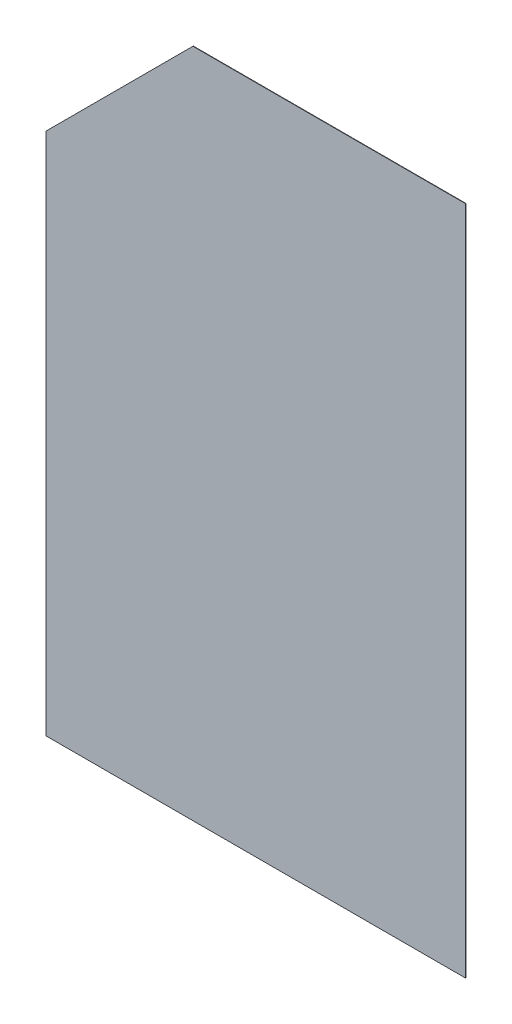
ISO-10303-21;
HEADER;
FILE_DESCRIPTION(('STEP AP214'),'2;1');
FILE_NAME('part.step','',(''),(''),'','','');
FILE_SCHEMA(('AUTOMOTIVE_DESIGN { 1 0 10303 214 1 1 1 1 }'));
ENDSEC;
DATA;
#1=APPLICATION_CONTEXT('core data for automotive mechanical design processes');
#2=APPLICATION_PROTOCOL_DEFINITION('international standard','automotive_design',2000,#1);
#3=PRODUCT_CONTEXT('',#1,'mechanical');
#4=PRODUCT('Part','Part','',(#3));
#5=PRODUCT_RELATED_PRODUCT_CATEGORY('part','',(#4));
#6=PRODUCT_DEFINITION_FORMATION('','',#4);
#7=PRODUCT_DEFINITION_CONTEXT('part definition',#1,'design');
#8=PRODUCT_DEFINITION('design','',#6,#7);
#9=PRODUCT_DEFINITION_SHAPE('','',#8);
#10=(LENGTH_UNIT() NAMED_UNIT(*) SI_UNIT(.MILLI.,.METRE.));
#11=(NAMED_UNIT(*) PLANE_ANGLE_UNIT() SI_UNIT($,.RADIAN.));
#12=(NAMED_UNIT(*) SI_UNIT($,.STERADIAN.) SOLID_ANGLE_UNIT());
#13=UNCERTAINTY_MEASURE_WITH_UNIT(LENGTH_MEASURE(1.E-05),#10,'distance_accuracy_value','');
#14=(GEOMETRIC_REPRESENTATION_CONTEXT(3) GLOBAL_UNCERTAINTY_ASSIGNED_CONTEXT((#13)) GLOBAL_UNIT_ASSIGNED_CONTEXT((#10,
#11,#12)) REPRESENTATION_CONTEXT('',''));
#15=CARTESIAN_POINT('',(0.,0.,0.));
#16=DIRECTION('',(0.,0.,1.));
#17=DIRECTION('',(1.,0.,0.));
#18=AXIS2_PLACEMENT_3D('',#15,#16,#17);
#19=CARTESIAN_POINT('',(0.,0.,0.001));
#20=DIRECTION('',(0.,0.,-1.));
#21=DIRECTION('',(-1.,0.,0.));
#22=AXIS2_PLACEMENT_3D('',#19,#20,#21);
#23=PLANE('',#22);
#24=DIRECTION('',(0.,1.,0.));
#25=VECTOR('',#24,1.);
#26=CARTESIAN_POINT('',(1.,0.,0.001));
#27=LINE('',#26,#25);
#28=CARTESIAN_POINT('',(1.,0.,0.001));
#29=VERTEX_POINT('',#28);
#30=CARTESIAN_POINT('',(1.,1.6,0.001));
#31=VERTEX_POINT('',#30);
#32=EDGE_CURVE('E85',#29,#31,#27,.T.);
#33=ORIENTED_EDGE('',*,*,#32,.T.);
#34=DIRECTION('',(1.,0.,0.));
#35=VECTOR('',#34,1.);
#36=CARTESIAN_POINT('',(1.,1.6,0.001));
#37=LINE('',#36,#35);
#38=CARTESIAN_POINT('',(0.35,1.6,0.001));
#39=VERTEX_POINT('',#38);
#40=EDGE_CURVE('E66',#31,#39,#37,.F.);
#41=ORIENTED_EDGE('',*,*,#40,.T.);
#42=DIRECTION('',(0.707106781186548,0.707106781186548,0.));
#43=VECTOR('',#42,1.);
#44=CARTESIAN_POINT('',(0.35,1.6,0.001));
#45=LINE('',#44,#43);
#46=CARTESIAN_POINT('',(0.,1.25,0.001));
#47=VERTEX_POINT('',#46);
#48=EDGE_CURVE('E60',#39,#47,#45,.F.);
#49=ORIENTED_EDGE('',*,*,#48,.T.);
#50=DIRECTION('',(0.,1.,0.));
#51=VECTOR('',#50,1.);
#52=CARTESIAN_POINT('',(0.,1.25,0.001));
#53=LINE('',#52,#51);
#54=CARTESIAN_POINT('',(0.,0.,0.001));
#55=VERTEX_POINT('',#54);
#56=EDGE_CURVE('E63',#47,#55,#53,.F.);
#57=ORIENTED_EDGE('',*,*,#56,.T.);
#58=DIRECTION('',(1.,0.,0.));
#59=VECTOR('',#58,1.);
#60=CARTESIAN_POINT('',(0.,0.,0.001));
#61=LINE('',#60,#59);
#62=EDGE_CURVE('E93',#55,#29,#61,.T.);
#63=ORIENTED_EDGE('',*,*,#62,.T.);
#64=EDGE_LOOP('',(#33,#41,#49,#57,#63));
#65=FACE_BOUND('',#64,.T.);
#66=ADVANCED_FACE('F17',(#65),#23,.F.);
#67=CARTESIAN_POINT('',(0.,1.25,0.));
#68=DIRECTION('',(1.,0.,0.));
#69=DIRECTION('',(0.,0.,-1.));
#70=AXIS2_PLACEMENT_3D('',#67,#68,#69);
#71=PLANE('',#70);
#72=DIRECTION('',(0.,0.,-1.));
#73=VECTOR('',#72,1.);
#74=CARTESIAN_POINT('',(0.,0.,0.));
#75=LINE('',#74,#73);
#76=CARTESIAN_POINT('',(0.,0.,0.));
#77=VERTEX_POINT('',#76);
#78=EDGE_CURVE('E76',#77,#55,#75,.F.);
#79=ORIENTED_EDGE('',*,*,#78,.T.);
#80=ORIENTED_EDGE('',*,*,#56,.F.);
#81=DIRECTION('',(0.,0.,-1.));
#82=VECTOR('',#81,1.);
#83=CARTESIAN_POINT('',(0.,1.25,0.));
#84=LINE('',#83,#82);
#85=CARTESIAN_POINT('',(0.,1.25,0.));
#86=VERTEX_POINT('',#85);
#87=EDGE_CURVE('E20',#47,#86,#84,.T.);
#88=ORIENTED_EDGE('',*,*,#87,.T.);
#89=DIRECTION('',(0.,1.,0.));
#90=VECTOR('',#89,1.);
#91=CARTESIAN_POINT('',(0.,0.,0.));
#92=LINE('',#91,#90);
#93=EDGE_CURVE('E90',#77,#86,#92,.T.);
#94=ORIENTED_EDGE('',*,*,#93,.F.);
#95=EDGE_LOOP('',(#79,#80,#88,#94));
#96=FACE_BOUND('',#95,.T.);
#97=ADVANCED_FACE('F73',(#96),#71,.F.);
#98=CARTESIAN_POINT('',(0.35,1.6,0.));
#99=DIRECTION('',(0.707106781186548,-0.707106781186548,0.));
#100=DIRECTION('',(0.707106781186548,0.707106781186548,0.));
#101=AXIS2_PLACEMENT_3D('',#98,#99,#100);
#102=PLANE('',#101);
#103=ORIENTED_EDGE('',*,*,#87,.F.);
#104=ORIENTED_EDGE('',*,*,#48,.F.);
#105=DIRECTION('',(0.,0.,1.));
#106=VECTOR('',#105,1.);
#107=CARTESIAN_POINT('',(0.35,1.6,0.));
#108=LINE('',#107,#106);
#109=CARTESIAN_POINT('',(0.35,1.6,0.));
#110=VERTEX_POINT('',#109);
#111=EDGE_CURVE('E83',#39,#110,#108,.F.);
#112=ORIENTED_EDGE('',*,*,#111,.T.);
#113=DIRECTION('',(0.707106781186547,0.707106781186548,0.));
#114=VECTOR('',#113,1.);
#115=CARTESIAN_POINT('',(0.,1.25,0.));
#116=LINE('',#115,#114);
#117=EDGE_CURVE('E81',#86,#110,#116,.T.);
#118=ORIENTED_EDGE('',*,*,#117,.F.);
#119=EDGE_LOOP('',(#103,#104,#112,#118));
#120=FACE_BOUND('',#119,.T.);
#121=ADVANCED_FACE('F79',(#120),#102,.F.);
#122=CARTESIAN_POINT('',(1.,1.6,0.));
#123=DIRECTION('',(0.,-1.,0.));
#124=DIRECTION('',(0.,0.,-1.));
#125=AXIS2_PLACEMENT_3D('',#122,#123,#124);
#126=PLANE('',#125);
#127=ORIENTED_EDGE('',*,*,#111,.F.);
#128=ORIENTED_EDGE('',*,*,#40,.F.);
#129=DIRECTION('',(0.,0.,-1.));
#130=VECTOR('',#129,1.);
#131=CARTESIAN_POINT('',(1.,1.6,0.));
#132=LINE('',#131,#130);
#133=CARTESIAN_POINT('',(1.,1.6,0.));
#134=VERTEX_POINT('',#133);
#135=EDGE_CURVE('E95',#31,#134,#132,.T.);
#136=ORIENTED_EDGE('',*,*,#135,.T.);
#137=DIRECTION('',(-1.,0.,0.));
#138=VECTOR('',#137,1.);
#139=CARTESIAN_POINT('',(0.,1.6,0.));
#140=LINE('',#139,#138);
#141=EDGE_CURVE('E88',#110,#134,#140,.F.);
#142=ORIENTED_EDGE('',*,*,#141,.F.);
#143=EDGE_LOOP('',(#127,#128,#136,#142));
#144=FACE_BOUND('',#143,.T.);
#145=ADVANCED_FACE('F109',(#144),#126,.F.);
#146=CARTESIAN_POINT('',(1.,0.,0.));
#147=DIRECTION('',(-1.,0.,0.));
#148=DIRECTION('',(0.,0.,1.));
#149=AXIS2_PLACEMENT_3D('',#146,#147,#148);
#150=PLANE('',#149);
#151=ORIENTED_EDGE('',*,*,#135,.F.);
#152=ORIENTED_EDGE('',*,*,#32,.F.);
#153=DIRECTION('',(0.,0.,1.));
#154=VECTOR('',#153,1.);
#155=CARTESIAN_POINT('',(1.,0.,0.));
#156=LINE('',#155,#154);
#157=CARTESIAN_POINT('',(1.,0.,0.));
#158=VERTEX_POINT('',#157);
#159=EDGE_CURVE('E35',#29,#158,#156,.F.);
#160=ORIENTED_EDGE('',*,*,#159,.T.);
#161=DIRECTION('',(0.,1.,0.));
#162=VECTOR('',#161,1.);
#163=CARTESIAN_POINT('',(1.,0.,0.));
#164=LINE('',#163,#162);
#165=EDGE_CURVE('E26',#134,#158,#164,.F.);
#166=ORIENTED_EDGE('',*,*,#165,.F.);
#167=EDGE_LOOP('',(#151,#152,#160,#166));
#168=FACE_BOUND('',#167,.T.);
#169=ADVANCED_FACE('F104',(#168),#150,.F.);
#170=CARTESIAN_POINT('',(0.,0.,0.));
#171=DIRECTION('',(0.,1.,0.));
#172=DIRECTION('',(0.,0.,1.));
#173=AXIS2_PLACEMENT_3D('',#170,#171,#172);
#174=PLANE('',#173);
#175=ORIENTED_EDGE('',*,*,#159,.F.);
#176=ORIENTED_EDGE('',*,*,#62,.F.);
#177=ORIENTED_EDGE('',*,*,#78,.F.);
#178=DIRECTION('',(-1.,0.,0.));
#179=VECTOR('',#178,1.);
#180=CARTESIAN_POINT('',(0.,0.,0.));
#181=LINE('',#180,#179);
#182=EDGE_CURVE('E11',#158,#77,#181,.T.);
#183=ORIENTED_EDGE('',*,*,#182,.F.);
#184=EDGE_LOOP('',(#175,#176,#177,#183));
#185=FACE_BOUND('',#184,.T.);
#186=ADVANCED_FACE('F105',(#185),#174,.F.);
#187=CARTESIAN_POINT('',(0.,0.,0.));
#188=DIRECTION('',(0.,0.,-1.));
#189=DIRECTION('',(-1.,0.,0.));
#190=AXIS2_PLACEMENT_3D('',#187,#188,#189);
#191=PLANE('',#190);
#192=ORIENTED_EDGE('',*,*,#165,.T.);
#193=ORIENTED_EDGE('',*,*,#182,.T.);
#194=ORIENTED_EDGE('',*,*,#93,.T.);
#195=ORIENTED_EDGE('',*,*,#117,.T.);
#196=ORIENTED_EDGE('',*,*,#141,.T.);
#197=EDGE_LOOP('',(#192,#193,#194,#195,#196));
#198=FACE_BOUND('',#197,.T.);
#199=ADVANCED_FACE('F108',(#198),#191,.T.);
#200=CLOSED_SHELL('',(#66,#97,#121,#145,#169,#186,#199));
#201=MANIFOLD_SOLID_BREP('B1',#200);
#202=ADVANCED_BREP_SHAPE_REPRESENTATION('',(#18,#201),#14);
#203=SHAPE_DEFINITION_REPRESENTATION(#9,#202);
ENDSEC;
END-ISO-10303-21;
